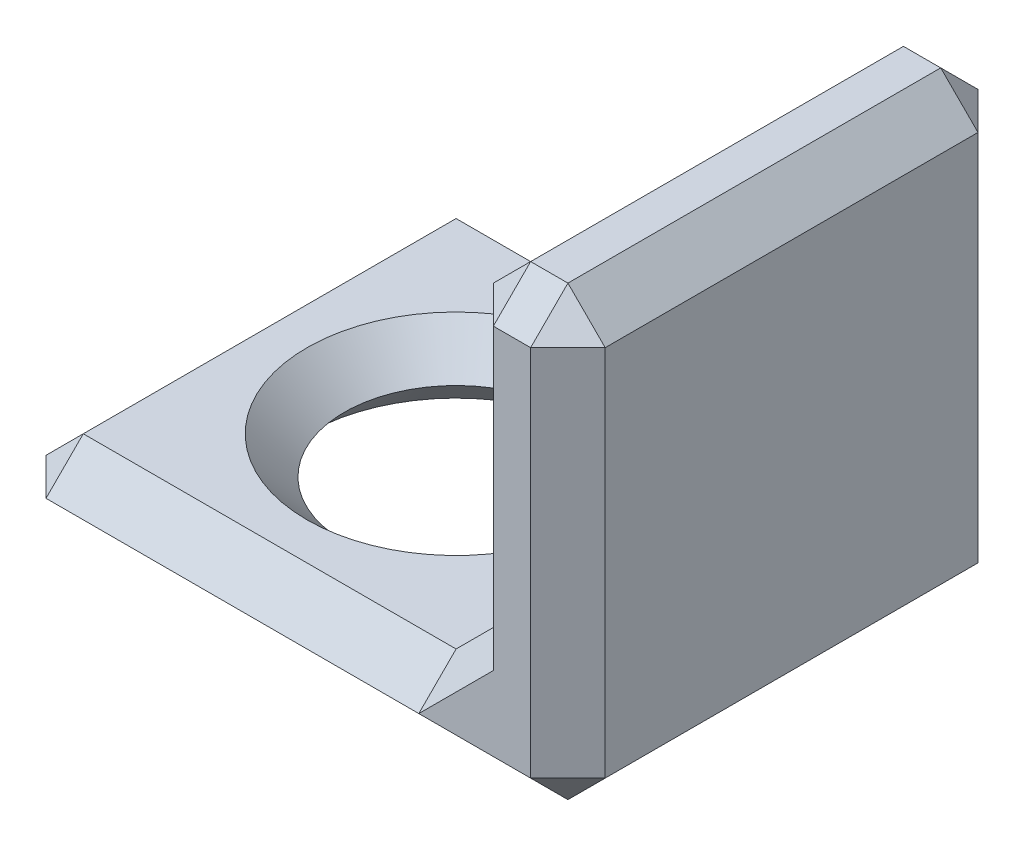
ISO-10303-21;
HEADER;
FILE_DESCRIPTION(('STEP AP214'),'2;1');
FILE_NAME('part.step','',(''),(''),'','','');
FILE_SCHEMA(('AUTOMOTIVE_DESIGN { 1 0 10303 214 1 1 1 1 }'));
ENDSEC;
DATA;
#1=APPLICATION_CONTEXT('core data for automotive mechanical design processes');
#2=APPLICATION_PROTOCOL_DEFINITION('international standard','automotive_design',2000,#1);
#3=PRODUCT_CONTEXT('',#1,'mechanical');
#4=PRODUCT('Part','Part','',(#3));
#5=PRODUCT_RELATED_PRODUCT_CATEGORY('part','',(#4));
#6=PRODUCT_DEFINITION_FORMATION('','',#4);
#7=PRODUCT_DEFINITION_CONTEXT('part definition',#1,'design');
#8=PRODUCT_DEFINITION('design','',#6,#7);
#9=PRODUCT_DEFINITION_SHAPE('','',#8);
#10=(LENGTH_UNIT() NAMED_UNIT(*) SI_UNIT(.MILLI.,.METRE.));
#11=(NAMED_UNIT(*) PLANE_ANGLE_UNIT() SI_UNIT($,.RADIAN.));
#12=(NAMED_UNIT(*) SI_UNIT($,.STERADIAN.) SOLID_ANGLE_UNIT());
#13=UNCERTAINTY_MEASURE_WITH_UNIT(LENGTH_MEASURE(1.E-05),#10,'distance_accuracy_value','');
#14=(GEOMETRIC_REPRESENTATION_CONTEXT(3) GLOBAL_UNCERTAINTY_ASSIGNED_CONTEXT((#13)) GLOBAL_UNIT_ASSIGNED_CONTEXT((#10,
#11,#12)) REPRESENTATION_CONTEXT('',''));
#15=CARTESIAN_POINT('',(0.,0.,0.));
#16=DIRECTION('',(0.,0.,1.));
#17=DIRECTION('',(1.,0.,0.));
#18=AXIS2_PLACEMENT_3D('',#15,#16,#17);
#19=CARTESIAN_POINT('',(0.,2.,12.));
#20=DIRECTION('',(0.,0.,-1.));
#21=DIRECTION('',(-1.,0.,0.));
#22=AXIS2_PLACEMENT_3D('',#19,#20,#21);
#23=PLANE('',#22);
#24=DIRECTION('',(0.707106781186546,0.707106781186549,0.));
#25=VECTOR('',#24,1.);
#26=CARTESIAN_POINT('',(13.,3.,12.));
#27=LINE('',#26,#25);
#28=CARTESIAN_POINT('',(12.,2.,12.));
#29=VERTEX_POINT('',#28);
#30=CARTESIAN_POINT('',(13.,3.,12.));
#31=VERTEX_POINT('',#30);
#32=EDGE_CURVE('E11',#29,#31,#27,.T.);
#33=ORIENTED_EDGE('',*,*,#32,.F.);
#34=DIRECTION('',(0.707106781186546,0.707106781186549,0.));
#35=VECTOR('',#34,1.);
#36=CARTESIAN_POINT('',(13.,3.,12.));
#37=LINE('',#36,#35);
#38=CARTESIAN_POINT('',(11.,0.999999999999997,12.));
#39=VERTEX_POINT('',#38);
#40=EDGE_CURVE('E203',#39,#29,#37,.T.);
#41=ORIENTED_EDGE('',*,*,#40,.F.);
#42=DIRECTION('',(1.,0.,0.));
#43=VECTOR('',#42,1.);
#44=CARTESIAN_POINT('',(0.,0.999999999999997,12.));
#45=LINE('',#44,#43);
#46=CARTESIAN_POINT('',(14.,0.999999999999997,12.));
#47=VERTEX_POINT('',#46);
#48=EDGE_CURVE('E186',#39,#47,#45,.T.);
#49=ORIENTED_EDGE('',*,*,#48,.T.);
#50=DIRECTION('',(0.,1.,0.));
#51=VECTOR('',#50,1.);
#52=CARTESIAN_POINT('',(14.,12.,12.));
#53=LINE('',#52,#51);
#54=CARTESIAN_POINT('',(14.,11.,12.));
#55=VERTEX_POINT('',#54);
#56=EDGE_CURVE('E181',#47,#55,#53,.T.);
#57=ORIENTED_EDGE('',*,*,#56,.T.);
#58=DIRECTION('',(-1.,0.,0.));
#59=VECTOR('',#58,1.);
#60=CARTESIAN_POINT('',(12.,11.,12.));
#61=LINE('',#60,#59);
#62=CARTESIAN_POINT('',(13.,11.,12.));
#63=VERTEX_POINT('',#62);
#64=EDGE_CURVE('E183',#55,#63,#61,.T.);
#65=ORIENTED_EDGE('',*,*,#64,.T.);
#66=DIRECTION('',(0.,-1.,0.));
#67=VECTOR('',#66,1.);
#68=CARTESIAN_POINT('',(13.,2.,12.));
#69=LINE('',#68,#67);
#70=EDGE_CURVE('E59',#63,#31,#69,.T.);
#71=ORIENTED_EDGE('',*,*,#70,.T.);
#72=EDGE_LOOP('',(#33,#41,#49,#57,#65,#71));
#73=FACE_BOUND('',#72,.T.);
#74=ADVANCED_FACE('F47',(#73),#23,.F.);
#75=CARTESIAN_POINT('',(0.,2.,0.));
#76=DIRECTION('',(0.,1.,0.));
#77=DIRECTION('',(0.,0.,1.));
#78=AXIS2_PLACEMENT_3D('',#75,#76,#77);
#79=PLANE('',#78);
#80=CARTESIAN_POINT('',(6.,2.,6.));
#81=DIRECTION('',(0.,1.,0.));
#82=DIRECTION('',(0.,0.,1.));
#83=AXIS2_PLACEMENT_3D('',#80,#81,#82);
#84=CIRCLE('',#83,4.00000000000001);
#85=CARTESIAN_POINT('',(6.,2.,10.));
#86=VERTEX_POINT('',#85);
#87=EDGE_CURVE('E425',#86,#86,#84,.F.);
#88=ORIENTED_EDGE('',*,*,#87,.T.);
#89=EDGE_LOOP('',(#88));
#90=FACE_BOUND('',#89,.T.);
#91=DIRECTION('',(0.,0.,-1.));
#92=VECTOR('',#91,1.);
#93=CARTESIAN_POINT('',(11.,2.,0.));
#94=LINE('',#93,#92);
#95=CARTESIAN_POINT('',(11.,2.,11.));
#96=VERTEX_POINT('',#95);
#97=CARTESIAN_POINT('',(11.,2.,0.999999999999997));
#98=VERTEX_POINT('',#97);
#99=EDGE_CURVE('E272',#96,#98,#94,.T.);
#100=ORIENTED_EDGE('',*,*,#99,.T.);
#101=DIRECTION('',(-1.,0.,0.));
#102=VECTOR('',#101,1.);
#103=CARTESIAN_POINT('',(0.,2.,0.999999999999997));
#104=LINE('',#103,#102);
#105=CARTESIAN_POINT('',(0.999999999999997,2.,0.999999999999997));
#106=VERTEX_POINT('',#105);
#107=EDGE_CURVE('E420',#98,#106,#104,.T.);
#108=ORIENTED_EDGE('',*,*,#107,.T.);
#109=DIRECTION('',(0.,0.,1.));
#110=VECTOR('',#109,1.);
#111=CARTESIAN_POINT('',(0.999999999999997,2.,12.));
#112=LINE('',#111,#110);
#113=CARTESIAN_POINT('',(0.999999999999997,2.,11.));
#114=VERTEX_POINT('',#113);
#115=EDGE_CURVE('E416',#106,#114,#112,.T.);
#116=ORIENTED_EDGE('',*,*,#115,.T.);
#117=DIRECTION('',(1.,0.,0.));
#118=VECTOR('',#117,1.);
#119=CARTESIAN_POINT('',(12.,2.,11.));
#120=LINE('',#119,#118);
#121=EDGE_CURVE('E265',#114,#96,#120,.T.);
#122=ORIENTED_EDGE('',*,*,#121,.T.);
#123=EDGE_LOOP('',(#100,#108,#116,#122));
#124=FACE_BOUND('',#123,.T.);
#125=ADVANCED_FACE('F518',(#90,#124),#79,.T.);
#126=CARTESIAN_POINT('',(0.,0.,0.));
#127=DIRECTION('',(0.,1.,0.));
#128=DIRECTION('',(0.,0.,1.));
#129=AXIS2_PLACEMENT_3D('',#126,#127,#128);
#130=PLANE('',#129);
#131=CARTESIAN_POINT('',(6.,0.,6.));
#132=DIRECTION('',(0.,1.,0.));
#133=DIRECTION('',(0.,0.,1.));
#134=AXIS2_PLACEMENT_3D('',#131,#132,#133);
#135=CIRCLE('',#134,4.);
#136=CARTESIAN_POINT('',(6.,0.,10.));
#137=VERTEX_POINT('',#136);
#138=EDGE_CURVE('E441',#137,#137,#135,.T.);
#139=ORIENTED_EDGE('',*,*,#138,.T.);
#140=EDGE_LOOP('',(#139));
#141=FACE_BOUND('',#140,.T.);
#142=DIRECTION('',(-1.,0.,0.));
#143=VECTOR('',#142,1.);
#144=CARTESIAN_POINT('',(0.,0.,11.));
#145=LINE('',#144,#143);
#146=CARTESIAN_POINT('',(14.,0.,11.));
#147=VERTEX_POINT('',#146);
#148=CARTESIAN_POINT('',(1.,0.,11.));
#149=VERTEX_POINT('',#148);
#150=EDGE_CURVE('E429',#147,#149,#145,.T.);
#151=ORIENTED_EDGE('',*,*,#150,.T.);
#152=DIRECTION('',(0.,0.,-1.));
#153=VECTOR('',#152,1.);
#154=CARTESIAN_POINT('',(1.,0.,0.));
#155=LINE('',#154,#153);
#156=CARTESIAN_POINT('',(1.,0.,1.));
#157=VERTEX_POINT('',#156);
#158=EDGE_CURVE('E437',#149,#157,#155,.T.);
#159=ORIENTED_EDGE('',*,*,#158,.T.);
#160=DIRECTION('',(1.,0.,0.));
#161=VECTOR('',#160,1.);
#162=CARTESIAN_POINT('',(0.,0.,1.));
#163=LINE('',#162,#161);
#164=CARTESIAN_POINT('',(14.,0.,1.));
#165=VERTEX_POINT('',#164);
#166=EDGE_CURVE('E434',#157,#165,#163,.T.);
#167=ORIENTED_EDGE('',*,*,#166,.T.);
#168=DIRECTION('',(0.,0.,1.));
#169=VECTOR('',#168,1.);
#170=CARTESIAN_POINT('',(14.,0.,12.));
#171=LINE('',#170,#169);
#172=EDGE_CURVE('E381',#165,#147,#171,.T.);
#173=ORIENTED_EDGE('',*,*,#172,.T.);
#174=EDGE_LOOP('',(#151,#159,#167,#173));
#175=FACE_BOUND('',#174,.T.);
#176=ADVANCED_FACE('F522',(#141,#175),#130,.F.);
#177=CARTESIAN_POINT('',(0.,2.,0.));
#178=DIRECTION('',(0.,0.,1.));
#179=DIRECTION('',(1.,0.,0.));
#180=AXIS2_PLACEMENT_3D('',#177,#178,#179);
#181=PLANE('',#180);
#182=DIRECTION('',(0.,1.,0.));
#183=VECTOR('',#182,1.);
#184=CARTESIAN_POINT('',(13.,12.,0.));
#185=LINE('',#184,#183);
#186=CARTESIAN_POINT('',(13.,3.,0.));
#187=VERTEX_POINT('',#186);
#188=CARTESIAN_POINT('',(13.,11.,0.));
#189=VERTEX_POINT('',#188);
#190=EDGE_CURVE('E480',#187,#189,#185,.T.);
#191=ORIENTED_EDGE('',*,*,#190,.T.);
#192=DIRECTION('',(1.,0.,0.));
#193=VECTOR('',#192,1.);
#194=CARTESIAN_POINT('',(15.,11.,0.));
#195=LINE('',#194,#193);
#196=CARTESIAN_POINT('',(14.,11.,0.));
#197=VERTEX_POINT('',#196);
#198=EDGE_CURVE('E483',#189,#197,#195,.T.);
#199=ORIENTED_EDGE('',*,*,#198,.T.);
#200=DIRECTION('',(0.,-1.,0.));
#201=VECTOR('',#200,1.);
#202=CARTESIAN_POINT('',(14.,0.,0.));
#203=LINE('',#202,#201);
#204=CARTESIAN_POINT('',(14.,0.999999999999997,0.));
#205=VERTEX_POINT('',#204);
#206=EDGE_CURVE('E468',#197,#205,#203,.T.);
#207=ORIENTED_EDGE('',*,*,#206,.T.);
#208=DIRECTION('',(-1.,0.,0.));
#209=VECTOR('',#208,1.);
#210=CARTESIAN_POINT('',(0.,0.999999999999997,0.));
#211=LINE('',#210,#209);
#212=CARTESIAN_POINT('',(11.,0.999999999999997,0.));
#213=VERTEX_POINT('',#212);
#214=EDGE_CURVE('E470',#205,#213,#211,.T.);
#215=ORIENTED_EDGE('',*,*,#214,.T.);
#216=DIRECTION('',(-0.707106781186546,-0.707106781186549,0.));
#217=VECTOR('',#216,1.);
#218=CARTESIAN_POINT('',(11.,0.999999999999996,0.));
#219=LINE('',#218,#217);
#220=CARTESIAN_POINT('',(12.,2.,0.));
#221=VERTEX_POINT('',#220);
#222=EDGE_CURVE('E472',#221,#213,#219,.T.);
#223=ORIENTED_EDGE('',*,*,#222,.F.);
#224=DIRECTION('',(-0.707106781186546,-0.707106781186549,0.));
#225=VECTOR('',#224,1.);
#226=CARTESIAN_POINT('',(11.,0.999999999999996,0.));
#227=LINE('',#226,#225);
#228=EDGE_CURVE('E476',#187,#221,#227,.T.);
#229=ORIENTED_EDGE('',*,*,#228,.F.);
#230=EDGE_LOOP('',(#191,#199,#207,#215,#223,#229));
#231=FACE_BOUND('',#230,.T.);
#232=ADVANCED_FACE('F527',(#231),#181,.F.);
#233=CARTESIAN_POINT('',(12.,0.,0.));
#234=DIRECTION('',(-1.,0.,0.));
#235=DIRECTION('',(0.,0.,1.));
#236=AXIS2_PLACEMENT_3D('',#233,#234,#235);
#237=PLANE('',#236);
#238=DIRECTION('',(0.,0.,-1.));
#239=VECTOR('',#238,1.);
#240=CARTESIAN_POINT('',(12.,11.,0.));
#241=LINE('',#240,#239);
#242=CARTESIAN_POINT('',(12.,11.,11.));
#243=VERTEX_POINT('',#242);
#244=CARTESIAN_POINT('',(12.,11.,1.));
#245=VERTEX_POINT('',#244);
#246=EDGE_CURVE('E447',#243,#245,#241,.T.);
#247=ORIENTED_EDGE('',*,*,#246,.T.);
#248=DIRECTION('',(0.,-1.,0.));
#249=VECTOR('',#248,1.);
#250=CARTESIAN_POINT('',(12.,2.,1.));
#251=LINE('',#250,#249);
#252=CARTESIAN_POINT('',(12.,3.,1.));
#253=VERTEX_POINT('',#252);
#254=EDGE_CURVE('E452',#245,#253,#251,.T.);
#255=ORIENTED_EDGE('',*,*,#254,.T.);
#256=DIRECTION('',(0.,0.,1.));
#257=VECTOR('',#256,1.);
#258=CARTESIAN_POINT('',(12.,3.,12.));
#259=LINE('',#258,#257);
#260=CARTESIAN_POINT('',(12.,3.,11.));
#261=VERTEX_POINT('',#260);
#262=EDGE_CURVE('E411',#253,#261,#259,.T.);
#263=ORIENTED_EDGE('',*,*,#262,.T.);
#264=DIRECTION('',(0.,1.,0.));
#265=VECTOR('',#264,1.);
#266=CARTESIAN_POINT('',(12.,12.,11.));
#267=LINE('',#266,#265);
#268=EDGE_CURVE('E401',#261,#243,#267,.T.);
#269=ORIENTED_EDGE('',*,*,#268,.T.);
#270=EDGE_LOOP('',(#247,#255,#263,#269));
#271=FACE_BOUND('',#270,.T.);
#272=ADVANCED_FACE('F506',(#271),#237,.T.);
#273=CARTESIAN_POINT('',(15.,0.,0.));
#274=DIRECTION('',(1.,0.,0.));
#275=DIRECTION('',(0.,0.,-1.));
#276=AXIS2_PLACEMENT_3D('',#273,#274,#275);
#277=PLANE('',#276);
#278=DIRECTION('',(0.,-1.,0.));
#279=VECTOR('',#278,1.);
#280=CARTESIAN_POINT('',(15.,0.,11.));
#281=LINE('',#280,#279);
#282=CARTESIAN_POINT('',(15.,11.,11.));
#283=VERTEX_POINT('',#282);
#284=CARTESIAN_POINT('',(15.,0.999999999999997,11.));
#285=VERTEX_POINT('',#284);
#286=EDGE_CURVE('E216',#283,#285,#281,.T.);
#287=ORIENTED_EDGE('',*,*,#286,.T.);
#288=DIRECTION('',(0.,0.,-1.));
#289=VECTOR('',#288,1.);
#290=CARTESIAN_POINT('',(15.,0.999999999999997,0.));
#291=LINE('',#290,#289);
#292=CARTESIAN_POINT('',(15.,0.999999999999997,0.999999999999997));
#293=VERTEX_POINT('',#292);
#294=EDGE_CURVE('E380',#285,#293,#291,.T.);
#295=ORIENTED_EDGE('',*,*,#294,.T.);
#296=DIRECTION('',(0.,1.,0.));
#297=VECTOR('',#296,1.);
#298=CARTESIAN_POINT('',(15.,12.,0.999999999999997));
#299=LINE('',#298,#297);
#300=CARTESIAN_POINT('',(15.,11.,0.999999999999997));
#301=VERTEX_POINT('',#300);
#302=EDGE_CURVE('E382',#293,#301,#299,.T.);
#303=ORIENTED_EDGE('',*,*,#302,.T.);
#304=DIRECTION('',(0.,0.,1.));
#305=VECTOR('',#304,1.);
#306=CARTESIAN_POINT('',(15.,11.,0.));
#307=LINE('',#306,#305);
#308=EDGE_CURVE('E387',#301,#283,#307,.T.);
#309=ORIENTED_EDGE('',*,*,#308,.T.);
#310=EDGE_LOOP('',(#287,#295,#303,#309));
#311=FACE_BOUND('',#310,.T.);
#312=ADVANCED_FACE('F389',(#311),#277,.T.);
#313=CARTESIAN_POINT('',(0.,12.,0.));
#314=DIRECTION('',(0.,1.,0.));
#315=DIRECTION('',(0.,0.,1.));
#316=AXIS2_PLACEMENT_3D('',#313,#314,#315);
#317=PLANE('',#316);
#318=DIRECTION('',(-1.,0.,0.));
#319=VECTOR('',#318,1.);
#320=CARTESIAN_POINT('',(12.,12.,0.999999999999997));
#321=LINE('',#320,#319);
#322=CARTESIAN_POINT('',(14.,12.,0.999999999999997));
#323=VERTEX_POINT('',#322);
#324=CARTESIAN_POINT('',(13.,12.,0.999999999999997));
#325=VERTEX_POINT('',#324);
#326=EDGE_CURVE('E461',#323,#325,#321,.T.);
#327=ORIENTED_EDGE('',*,*,#326,.T.);
#328=DIRECTION('',(0.,0.,1.));
#329=VECTOR('',#328,1.);
#330=CARTESIAN_POINT('',(13.,12.,0.));
#331=LINE('',#330,#329);
#332=CARTESIAN_POINT('',(13.,12.,11.));
#333=VERTEX_POINT('',#332);
#334=EDGE_CURVE('E464',#325,#333,#331,.T.);
#335=ORIENTED_EDGE('',*,*,#334,.T.);
#336=DIRECTION('',(1.,0.,0.));
#337=VECTOR('',#336,1.);
#338=CARTESIAN_POINT('',(15.,12.,11.));
#339=LINE('',#338,#337);
#340=CARTESIAN_POINT('',(14.,12.,11.));
#341=VERTEX_POINT('',#340);
#342=EDGE_CURVE('E455',#333,#341,#339,.T.);
#343=ORIENTED_EDGE('',*,*,#342,.T.);
#344=DIRECTION('',(0.,0.,-1.));
#345=VECTOR('',#344,1.);
#346=CARTESIAN_POINT('',(14.,12.,0.));
#347=LINE('',#346,#345);
#348=EDGE_CURVE('E458',#341,#323,#347,.T.);
#349=ORIENTED_EDGE('',*,*,#348,.T.);
#350=EDGE_LOOP('',(#327,#335,#343,#349));
#351=FACE_BOUND('',#350,.T.);
#352=ADVANCED_FACE('F489',(#351),#317,.T.);
#353=CARTESIAN_POINT('',(6.,0.,6.));
#354=DIRECTION('',(0.,-1.,0.));
#355=DIRECTION('',(0.,0.,-1.));
#356=AXIS2_PLACEMENT_3D('',#353,#354,#355);
#357=CONICAL_SURFACE('',#356,4.,0.785398163397447);
#358=ORIENTED_EDGE('',*,*,#138,.F.);
#359=EDGE_LOOP('',(#358));
#360=FACE_BOUND('',#359,.T.);
#361=CARTESIAN_POINT('',(6.,0.999999999999999,6.));
#362=DIRECTION('',(0.,1.,0.));
#363=DIRECTION('',(0.,0.,1.));
#364=AXIS2_PLACEMENT_3D('',#361,#362,#363);
#365=CIRCLE('',#364,3.);
#366=CARTESIAN_POINT('',(6.,0.999999999999999,9.));
#367=VERTEX_POINT('',#366);
#368=EDGE_CURVE('E258',#367,#367,#365,.F.);
#369=ORIENTED_EDGE('',*,*,#368,.F.);
#370=EDGE_LOOP('',(#369));
#371=FACE_BOUND('',#370,.T.);
#372=ADVANCED_FACE('F536',(#360,#371),#357,.F.);
#373=CARTESIAN_POINT('',(6.,0.999999999999998,6.));
#374=DIRECTION('',(0.,1.,0.));
#375=DIRECTION('',(0.,0.,1.));
#376=AXIS2_PLACEMENT_3D('',#373,#374,#375);
#377=CONICAL_SURFACE('',#376,3.,0.78539816339745);
#378=ORIENTED_EDGE('',*,*,#87,.F.);
#379=EDGE_LOOP('',(#378));
#380=FACE_BOUND('',#379,.T.);
#381=ORIENTED_EDGE('',*,*,#368,.T.);
#382=EDGE_LOOP('',(#381));
#383=FACE_BOUND('',#382,.T.);
#384=ADVANCED_FACE('F530',(#380,#383),#377,.F.);
#385=CARTESIAN_POINT('',(14.,12.,0.));
#386=DIRECTION('',(-0.707106781186549,-0.707106781186546,0.));
#387=DIRECTION('',(0.,0.,-1.));
#388=AXIS2_PLACEMENT_3D('',#385,#386,#387);
#389=PLANE('',#388);
#390=DIRECTION('',(-0.707106781186546,0.707106781186549,0.));
#391=VECTOR('',#390,1.);
#392=CARTESIAN_POINT('',(14.5,11.5,0.999999999999998));
#393=LINE('',#392,#391);
#394=EDGE_CURVE('E52',#323,#301,#393,.F.);
#395=ORIENTED_EDGE('',*,*,#394,.F.);
#396=ORIENTED_EDGE('',*,*,#348,.F.);
#397=DIRECTION('',(0.707106781186546,-0.707106781186549,0.));
#398=VECTOR('',#397,1.);
#399=CARTESIAN_POINT('',(15.,11.,11.));
#400=LINE('',#399,#398);
#401=EDGE_CURVE('E211',#283,#341,#400,.F.);
#402=ORIENTED_EDGE('',*,*,#401,.F.);
#403=ORIENTED_EDGE('',*,*,#308,.F.);
#404=EDGE_LOOP('',(#395,#396,#402,#403));
#405=FACE_BOUND('',#404,.T.);
#406=ADVANCED_FACE('F50',(#405),#389,.F.);
#407=CARTESIAN_POINT('',(14.,11.,0.));
#408=DIRECTION('',(0.577350269189626,0.577350269189624,-0.577350269189628));
#409=DIRECTION('',(-0.707106781186549,0.,-0.707106781186546));
#410=AXIS2_PLACEMENT_3D('',#407,#408,#409);
#411=PLANE('',#410);
#412=DIRECTION('',(-0.707106781186549,0.,-0.707106781186546));
#413=VECTOR('',#412,1.);
#414=CARTESIAN_POINT('',(14.,11.,0.));
#415=LINE('',#414,#413);
#416=EDGE_CURVE('E242',#197,#301,#415,.F.);
#417=ORIENTED_EDGE('',*,*,#416,.F.);
#418=DIRECTION('',(0.,0.707106781186549,0.707106781186546));
#419=VECTOR('',#418,1.);
#420=CARTESIAN_POINT('',(14.,11.,0.));
#421=LINE('',#420,#419);
#422=EDGE_CURVE('E213',#323,#197,#421,.F.);
#423=ORIENTED_EDGE('',*,*,#422,.F.);
#424=ORIENTED_EDGE('',*,*,#394,.T.);
#425=EDGE_LOOP('',(#417,#423,#424));
#426=FACE_BOUND('',#425,.T.);
#427=ADVANCED_FACE('F685',(#426),#411,.T.);
#428=CARTESIAN_POINT('',(0.,12.,0.999999999999997));
#429=DIRECTION('',(0.,0.707106781186546,-0.707106781186549));
#430=DIRECTION('',(1.,0.,0.));
#431=AXIS2_PLACEMENT_3D('',#428,#429,#430);
#432=PLANE('',#431);
#433=ORIENTED_EDGE('',*,*,#422,.T.);
#434=ORIENTED_EDGE('',*,*,#198,.F.);
#435=DIRECTION('',(0.,-0.707106781186549,-0.707106781186546));
#436=VECTOR('',#435,1.);
#437=CARTESIAN_POINT('',(13.,11.5,0.499999999999999));
#438=LINE('',#437,#436);
#439=EDGE_CURVE('E238',#325,#189,#438,.T.);
#440=ORIENTED_EDGE('',*,*,#439,.F.);
#441=ORIENTED_EDGE('',*,*,#326,.F.);
#442=EDGE_LOOP('',(#433,#434,#440,#441));
#443=FACE_BOUND('',#442,.T.);
#444=ADVANCED_FACE('F498',(#443),#432,.T.);
#445=CARTESIAN_POINT('',(13.,12.,0.));
#446=DIRECTION('',(0.707106781186549,-0.707106781186546,0.));
#447=DIRECTION('',(0.,0.,1.));
#448=AXIS2_PLACEMENT_3D('',#445,#446,#447);
#449=PLANE('',#448);
#450=DIRECTION('',(0.707106781186546,0.707106781186549,0.));
#451=VECTOR('',#450,1.);
#452=CARTESIAN_POINT('',(13.,12.,11.));
#453=LINE('',#452,#451);
#454=EDGE_CURVE('E223',#333,#243,#453,.F.);
#455=ORIENTED_EDGE('',*,*,#454,.F.);
#456=ORIENTED_EDGE('',*,*,#334,.F.);
#457=DIRECTION('',(-0.707106781186546,-0.707106781186549,0.));
#458=VECTOR('',#457,1.);
#459=CARTESIAN_POINT('',(12.,11.,1.));
#460=LINE('',#459,#458);
#461=EDGE_CURVE('E234',#245,#325,#460,.F.);
#462=ORIENTED_EDGE('',*,*,#461,.F.);
#463=ORIENTED_EDGE('',*,*,#246,.F.);
#464=EDGE_LOOP('',(#455,#456,#462,#463));
#465=FACE_BOUND('',#464,.T.);
#466=ADVANCED_FACE('F495',(#465),#449,.F.);
#467=CARTESIAN_POINT('',(0.,12.,11.));
#468=DIRECTION('',(0.,0.707106781186549,0.707106781186546));
#469=DIRECTION('',(-1.,0.,0.));
#470=AXIS2_PLACEMENT_3D('',#467,#468,#469);
#471=PLANE('',#470);
#472=DIRECTION('',(0.,-0.707106781186546,0.707106781186549));
#473=VECTOR('',#472,1.);
#474=CARTESIAN_POINT('',(14.,11.5,11.5));
#475=LINE('',#474,#473);
#476=EDGE_CURVE('E198',#341,#55,#475,.T.);
#477=ORIENTED_EDGE('',*,*,#476,.F.);
#478=ORIENTED_EDGE('',*,*,#342,.F.);
#479=DIRECTION('',(0.,0.707106781186546,-0.707106781186549));
#480=VECTOR('',#479,1.);
#481=CARTESIAN_POINT('',(13.,12.,11.));
#482=LINE('',#481,#480);
#483=EDGE_CURVE('E200',#63,#333,#482,.T.);
#484=ORIENTED_EDGE('',*,*,#483,.F.);
#485=ORIENTED_EDGE('',*,*,#64,.F.);
#486=EDGE_LOOP('',(#477,#478,#484,#485));
#487=FACE_BOUND('',#486,.T.);
#488=ADVANCED_FACE('F196',(#487),#471,.T.);
#489=CARTESIAN_POINT('',(15.,11.,11.));
#490=DIRECTION('',(0.577350269189628,0.577350269189626,0.577350269189624));
#491=DIRECTION('',(-0.707106781186546,0.707106781186549,0.));
#492=AXIS2_PLACEMENT_3D('',#489,#490,#491);
#493=PLANE('',#492);
#494=ORIENTED_EDGE('',*,*,#401,.T.);
#495=ORIENTED_EDGE('',*,*,#476,.T.);
#496=DIRECTION('',(0.707106781186546,0.,-0.707106781186549));
#497=VECTOR('',#496,1.);
#498=CARTESIAN_POINT('',(15.,11.,11.));
#499=LINE('',#498,#497);
#500=EDGE_CURVE('E208',#283,#55,#499,.F.);
#501=ORIENTED_EDGE('',*,*,#500,.F.);
#502=EDGE_LOOP('',(#494,#495,#501));
#503=FACE_BOUND('',#502,.T.);
#504=ADVANCED_FACE('F207',(#503),#493,.T.);
#505=CARTESIAN_POINT('',(15.,0.,0.999999999999997));
#506=DIRECTION('',(0.707106781186546,0.,-0.707106781186549));
#507=DIRECTION('',(0.,-1.,0.));
#508=AXIS2_PLACEMENT_3D('',#505,#506,#507);
#509=PLANE('',#508);
#510=ORIENTED_EDGE('',*,*,#416,.T.);
#511=ORIENTED_EDGE('',*,*,#302,.F.);
#512=DIRECTION('',(0.707106781186549,0.,0.707106781186546));
#513=VECTOR('',#512,1.);
#514=CARTESIAN_POINT('',(14.5,0.999999999999997,0.499999999999999));
#515=LINE('',#514,#513);
#516=EDGE_CURVE('E227',#205,#293,#515,.T.);
#517=ORIENTED_EDGE('',*,*,#516,.F.);
#518=ORIENTED_EDGE('',*,*,#206,.F.);
#519=EDGE_LOOP('',(#510,#511,#517,#518));
#520=FACE_BOUND('',#519,.T.);
#521=ADVANCED_FACE('F383',(#520),#509,.T.);
#522=CARTESIAN_POINT('',(12.,11.,1.));
#523=DIRECTION('',(-0.577350269189628,0.577350269189624,-0.577350269189626));
#524=DIRECTION('',(-0.707106781186546,0.,0.707106781186549));
#525=AXIS2_PLACEMENT_3D('',#522,#523,#524);
#526=PLANE('',#525);
#527=ORIENTED_EDGE('',*,*,#461,.T.);
#528=ORIENTED_EDGE('',*,*,#439,.T.);
#529=DIRECTION('',(-0.707106781186546,0.,0.707106781186549));
#530=VECTOR('',#529,1.);
#531=CARTESIAN_POINT('',(12.,11.,1.));
#532=LINE('',#531,#530);
#533=EDGE_CURVE('E361',#245,#189,#532,.F.);
#534=ORIENTED_EDGE('',*,*,#533,.F.);
#535=EDGE_LOOP('',(#527,#528,#534));
#536=FACE_BOUND('',#535,.T.);
#537=ADVANCED_FACE('F500',(#536),#526,.T.);
#538=CARTESIAN_POINT('',(13.,12.,11.));
#539=DIRECTION('',(-0.577350269189628,0.577350269189626,0.577350269189624));
#540=DIRECTION('',(-0.707106781186546,-0.707106781186549,0.));
#541=AXIS2_PLACEMENT_3D('',#538,#539,#540);
#542=PLANE('',#541);
#543=ORIENTED_EDGE('',*,*,#483,.T.);
#544=ORIENTED_EDGE('',*,*,#454,.T.);
#545=DIRECTION('',(0.707106781186546,0.,0.707106781186549));
#546=VECTOR('',#545,1.);
#547=CARTESIAN_POINT('',(12.5,11.,11.5));
#548=LINE('',#547,#546);
#549=EDGE_CURVE('E357',#63,#243,#548,.F.);
#550=ORIENTED_EDGE('',*,*,#549,.F.);
#551=EDGE_LOOP('',(#543,#544,#550));
#552=FACE_BOUND('',#551,.T.);
#553=ADVANCED_FACE('F508',(#552),#542,.T.);
#554=CARTESIAN_POINT('',(14.,2.,12.));
#555=DIRECTION('',(0.707106781186549,0.,0.707106781186546));
#556=DIRECTION('',(0.,-1.,0.));
#557=AXIS2_PLACEMENT_3D('',#554,#555,#556);
#558=PLANE('',#557);
#559=ORIENTED_EDGE('',*,*,#500,.T.);
#560=ORIENTED_EDGE('',*,*,#56,.F.);
#561=DIRECTION('',(-0.707106781186546,0.,0.707106781186549));
#562=VECTOR('',#561,1.);
#563=CARTESIAN_POINT('',(14.5,0.999999999999997,11.5));
#564=LINE('',#563,#562);
#565=EDGE_CURVE('E354',#285,#47,#564,.T.);
#566=ORIENTED_EDGE('',*,*,#565,.F.);
#567=ORIENTED_EDGE('',*,*,#286,.F.);
#568=EDGE_LOOP('',(#559,#560,#566,#567));
#569=FACE_BOUND('',#568,.T.);
#570=ADVANCED_FACE('F215',(#569),#558,.T.);
#571=CARTESIAN_POINT('',(15.,0.999999999999997,0.));
#572=DIRECTION('',(0.707106781186546,-0.707106781186549,0.));
#573=DIRECTION('',(0.,0.,1.));
#574=AXIS2_PLACEMENT_3D('',#571,#572,#573);
#575=PLANE('',#574);
#576=DIRECTION('',(-0.707106781186549,-0.707106781186546,0.));
#577=VECTOR('',#576,1.);
#578=CARTESIAN_POINT('',(14.,0.,1.));
#579=LINE('',#578,#577);
#580=EDGE_CURVE('E218',#293,#165,#579,.T.);
#581=ORIENTED_EDGE('',*,*,#580,.F.);
#582=ORIENTED_EDGE('',*,*,#294,.F.);
#583=DIRECTION('',(0.707106781186549,0.707106781186546,0.));
#584=VECTOR('',#583,1.);
#585=CARTESIAN_POINT('',(14.,0.,11.));
#586=LINE('',#585,#584);
#587=EDGE_CURVE('E350',#147,#285,#586,.T.);
#588=ORIENTED_EDGE('',*,*,#587,.F.);
#589=ORIENTED_EDGE('',*,*,#172,.F.);
#590=EDGE_LOOP('',(#581,#582,#588,#589));
#591=FACE_BOUND('',#590,.T.);
#592=ADVANCED_FACE('F377',(#591),#575,.T.);
#593=CARTESIAN_POINT('',(14.,0.,1.));
#594=DIRECTION('',(0.577350269189624,-0.577350269189628,-0.577350269189626));
#595=DIRECTION('',(0.,0.707106781186546,-0.707106781186549));
#596=AXIS2_PLACEMENT_3D('',#593,#594,#595);
#597=PLANE('',#596);
#598=ORIENTED_EDGE('',*,*,#516,.T.);
#599=ORIENTED_EDGE('',*,*,#580,.T.);
#600=DIRECTION('',(0.,-0.707106781186546,0.707106781186549));
#601=VECTOR('',#600,1.);
#602=CARTESIAN_POINT('',(14.,0.,1.));
#603=LINE('',#602,#601);
#604=EDGE_CURVE('E346',#205,#165,#603,.T.);
#605=ORIENTED_EDGE('',*,*,#604,.F.);
#606=EDGE_LOOP('',(#598,#599,#605));
#607=FACE_BOUND('',#606,.T.);
#608=ADVANCED_FACE('F370',(#607),#597,.T.);
#609=CARTESIAN_POINT('',(13.,2.,0.));
#610=DIRECTION('',(-0.707106781186549,0.,-0.707106781186546));
#611=DIRECTION('',(0.,-1.,0.));
#612=AXIS2_PLACEMENT_3D('',#609,#610,#611);
#613=PLANE('',#612);
#614=ORIENTED_EDGE('',*,*,#533,.T.);
#615=ORIENTED_EDGE('',*,*,#190,.F.);
#616=DIRECTION('',(0.707106781186546,0.,-0.707106781186549));
#617=VECTOR('',#616,1.);
#618=CARTESIAN_POINT('',(12.,3.,1.));
#619=LINE('',#618,#617);
#620=EDGE_CURVE('E342',#253,#187,#619,.T.);
#621=ORIENTED_EDGE('',*,*,#620,.F.);
#622=ORIENTED_EDGE('',*,*,#254,.F.);
#623=EDGE_LOOP('',(#614,#615,#621,#622));
#624=FACE_BOUND('',#623,.T.);
#625=ADVANCED_FACE('F504',(#624),#613,.T.);
#626=CARTESIAN_POINT('',(11.,2.,0.));
#627=DIRECTION('',(-0.707106781186549,0.707106781186546,0.));
#628=DIRECTION('',(0.,0.,1.));
#629=AXIS2_PLACEMENT_3D('',#626,#627,#628);
#630=PLANE('',#629);
#631=DIRECTION('',(0.707106781186546,0.707106781186549,0.));
#632=VECTOR('',#631,1.);
#633=CARTESIAN_POINT('',(12.,3.,11.));
#634=LINE('',#633,#632);
#635=EDGE_CURVE('E334',#261,#96,#634,.F.);
#636=ORIENTED_EDGE('',*,*,#635,.F.);
#637=ORIENTED_EDGE('',*,*,#262,.F.);
#638=DIRECTION('',(-0.707106781186546,-0.707106781186549,0.));
#639=VECTOR('',#638,1.);
#640=CARTESIAN_POINT('',(11.,2.,0.999999999999997));
#641=LINE('',#640,#639);
#642=EDGE_CURVE('E338',#98,#253,#641,.F.);
#643=ORIENTED_EDGE('',*,*,#642,.F.);
#644=ORIENTED_EDGE('',*,*,#99,.F.);
#645=EDGE_LOOP('',(#636,#637,#643,#644));
#646=FACE_BOUND('',#645,.T.);
#647=ADVANCED_FACE('F409',(#646),#630,.T.);
#648=CARTESIAN_POINT('',(12.,0.,11.));
#649=DIRECTION('',(-0.707106781186549,0.,0.707106781186546));
#650=DIRECTION('',(0.,-1.,0.));
#651=AXIS2_PLACEMENT_3D('',#648,#649,#650);
#652=PLANE('',#651);
#653=ORIENTED_EDGE('',*,*,#549,.T.);
#654=ORIENTED_EDGE('',*,*,#268,.F.);
#655=DIRECTION('',(-0.707106781186546,0.,-0.707106781186549));
#656=VECTOR('',#655,1.);
#657=CARTESIAN_POINT('',(13.,3.,12.));
#658=LINE('',#657,#656);
#659=EDGE_CURVE('E332',#31,#261,#658,.T.);
#660=ORIENTED_EDGE('',*,*,#659,.F.);
#661=ORIENTED_EDGE('',*,*,#70,.F.);
#662=EDGE_LOOP('',(#653,#654,#660,#661));
#663=FACE_BOUND('',#662,.T.);
#664=ADVANCED_FACE('F399',(#663),#652,.T.);
#665=CARTESIAN_POINT('',(14.,0.,11.));
#666=DIRECTION('',(0.577350269189626,-0.577350269189628,0.577350269189624));
#667=DIRECTION('',(0.707106781186549,0.707106781186546,0.));
#668=AXIS2_PLACEMENT_3D('',#665,#666,#667);
#669=PLANE('',#668);
#670=ORIENTED_EDGE('',*,*,#587,.T.);
#671=ORIENTED_EDGE('',*,*,#565,.T.);
#672=DIRECTION('',(0.,0.707106781186546,0.707106781186549));
#673=VECTOR('',#672,1.);
#674=CARTESIAN_POINT('',(14.,0.,11.));
#675=LINE('',#674,#673);
#676=EDGE_CURVE('E329',#147,#47,#675,.T.);
#677=ORIENTED_EDGE('',*,*,#676,.F.);
#678=EDGE_LOOP('',(#670,#671,#677));
#679=FACE_BOUND('',#678,.T.);
#680=ADVANCED_FACE('F624',(#679),#669,.T.);
#681=CARTESIAN_POINT('',(0.,0.999999999999997,0.));
#682=DIRECTION('',(0.,0.707106781186549,0.707106781186546));
#683=DIRECTION('',(-1.,0.,0.));
#684=AXIS2_PLACEMENT_3D('',#681,#682,#683);
#685=PLANE('',#684);
#686=ORIENTED_EDGE('',*,*,#604,.T.);
#687=ORIENTED_EDGE('',*,*,#166,.F.);
#688=DIRECTION('',(0.,0.707106781186546,-0.707106781186549));
#689=VECTOR('',#688,1.);
#690=CARTESIAN_POINT('',(1.,0.,1.));
#691=LINE('',#690,#689);
#692=CARTESIAN_POINT('',(1.,0.999999999999999,0.));
#693=VERTEX_POINT('',#692);
#694=EDGE_CURVE('E91',#693,#157,#691,.F.);
#695=ORIENTED_EDGE('',*,*,#694,.F.);
#696=DIRECTION('',(-1.,0.,0.));
#697=VECTOR('',#696,1.);
#698=CARTESIAN_POINT('',(0.,0.999999999999997,0.));
#699=LINE('',#698,#697);
#700=EDGE_CURVE('E317',#213,#693,#699,.T.);
#701=ORIENTED_EDGE('',*,*,#700,.F.);
#702=ORIENTED_EDGE('',*,*,#214,.F.);
#703=EDGE_LOOP('',(#686,#687,#695,#701,#702));
#704=FACE_BOUND('',#703,.T.);
#705=ADVANCED_FACE('F617',(#704),#685,.F.);
#706=CARTESIAN_POINT('',(11.,2.,0.999999999999997));
#707=DIRECTION('',(-0.577350269189625,0.577350269189625,-0.577350269189627));
#708=DIRECTION('',(-0.707106781186549,0.,0.707106781186546));
#709=AXIS2_PLACEMENT_3D('',#706,#707,#708);
#710=PLANE('',#709);
#711=ORIENTED_EDGE('',*,*,#228,.T.);
#712=ORIENTED_EDGE('',*,*,#222,.T.);
#713=DIRECTION('',(0.,0.707106781186549,0.707106781186546));
#714=VECTOR('',#713,1.);
#715=CARTESIAN_POINT('',(11.,0.999999999999999,0.));
#716=LINE('',#715,#714);
#717=EDGE_CURVE('E313',#98,#213,#716,.F.);
#718=ORIENTED_EDGE('',*,*,#717,.F.);
#719=ORIENTED_EDGE('',*,*,#642,.T.);
#720=ORIENTED_EDGE('',*,*,#620,.T.);
#721=EDGE_LOOP('',(#711,#712,#718,#719,#720));
#722=FACE_BOUND('',#721,.T.);
#723=ADVANCED_FACE('F611',(#722),#710,.T.);
#724=CARTESIAN_POINT('',(12.,3.,11.));
#725=DIRECTION('',(-0.577350269189627,0.577350269189625,0.577350269189625));
#726=DIRECTION('',(0.707106781186546,0.,0.707106781186549));
#727=AXIS2_PLACEMENT_3D('',#724,#725,#726);
#728=PLANE('',#727);
#729=ORIENTED_EDGE('',*,*,#659,.T.);
#730=ORIENTED_EDGE('',*,*,#635,.T.);
#731=DIRECTION('',(0.,-0.707106781186546,0.707106781186549));
#732=VECTOR('',#731,1.);
#733=CARTESIAN_POINT('',(11.,2.,11.));
#734=LINE('',#733,#732);
#735=EDGE_CURVE('E309',#39,#96,#734,.F.);
#736=ORIENTED_EDGE('',*,*,#735,.F.);
#737=ORIENTED_EDGE('',*,*,#40,.T.);
#738=ORIENTED_EDGE('',*,*,#32,.T.);
#739=EDGE_LOOP('',(#729,#730,#736,#737,#738));
#740=FACE_BOUND('',#739,.T.);
#741=ADVANCED_FACE('F404',(#740),#728,.T.);
#742=CARTESIAN_POINT('',(0.,0.999999999999997,12.));
#743=DIRECTION('',(0.,0.707106781186549,-0.707106781186546));
#744=DIRECTION('',(1.,0.,0.));
#745=AXIS2_PLACEMENT_3D('',#742,#743,#744);
#746=PLANE('',#745);
#747=DIRECTION('',(0.,-0.707106781186546,-0.707106781186549));
#748=VECTOR('',#747,1.);
#749=CARTESIAN_POINT('',(1.,0.499999999999999,11.5));
#750=LINE('',#749,#748);
#751=CARTESIAN_POINT('',(0.999999999999997,1.,12.));
#752=VERTEX_POINT('',#751);
#753=EDGE_CURVE('E83',#149,#752,#750,.F.);
#754=ORIENTED_EDGE('',*,*,#753,.F.);
#755=ORIENTED_EDGE('',*,*,#150,.F.);
#756=ORIENTED_EDGE('',*,*,#676,.T.);
#757=ORIENTED_EDGE('',*,*,#48,.F.);
#758=DIRECTION('',(1.,0.,0.));
#759=VECTOR('',#758,1.);
#760=CARTESIAN_POINT('',(0.,0.999999999999997,12.));
#761=LINE('',#760,#759);
#762=EDGE_CURVE('E305',#752,#39,#761,.T.);
#763=ORIENTED_EDGE('',*,*,#762,.F.);
#764=EDGE_LOOP('',(#754,#755,#756,#757,#763));
#765=FACE_BOUND('',#764,.T.);
#766=ADVANCED_FACE('F599',(#765),#746,.F.);
#767=CARTESIAN_POINT('',(0.,0.999999999999997,11.));
#768=DIRECTION('',(-0.577350269189626,-0.577350269189628,0.577350269189624));
#769=DIRECTION('',(0.707106781186549,-0.707106781186546,0.));
#770=AXIS2_PLACEMENT_3D('',#767,#768,#769);
#771=PLANE('',#770);
#772=DIRECTION('',(-0.707106781186549,0.707106781186546,0.));
#773=VECTOR('',#772,1.);
#774=CARTESIAN_POINT('',(0.,0.999999999999997,11.));
#775=LINE('',#774,#773);
#776=CARTESIAN_POINT('',(0.,0.999999999999999,11.));
#777=VERTEX_POINT('',#776);
#778=EDGE_CURVE('E297',#149,#777,#775,.T.);
#779=ORIENTED_EDGE('',*,*,#778,.F.);
#780=ORIENTED_EDGE('',*,*,#753,.T.);
#781=DIRECTION('',(0.707106781186546,0.,0.707106781186549));
#782=VECTOR('',#781,1.);
#783=CARTESIAN_POINT('',(0.,0.999999999999997,11.));
#784=LINE('',#783,#782);
#785=EDGE_CURVE('E301',#777,#752,#784,.T.);
#786=ORIENTED_EDGE('',*,*,#785,.F.);
#787=EDGE_LOOP('',(#779,#780,#786));
#788=FACE_BOUND('',#787,.T.);
#789=ADVANCED_FACE('F592',(#788),#771,.T.);
#790=CARTESIAN_POINT('',(1.,0.,1.));
#791=DIRECTION('',(-0.577350269189624,-0.577350269189628,-0.577350269189626));
#792=DIRECTION('',(0.,0.707106781186546,-0.707106781186549));
#793=AXIS2_PLACEMENT_3D('',#790,#791,#792);
#794=PLANE('',#793);
#795=DIRECTION('',(-0.707106781186549,0.,0.707106781186546));
#796=VECTOR('',#795,1.);
#797=CARTESIAN_POINT('',(0.500000000000001,0.999999999999997,0.499999999999999));
#798=LINE('',#797,#796);
#799=CARTESIAN_POINT('',(0.,0.999999999999999,0.999999999999997));
#800=VERTEX_POINT('',#799);
#801=EDGE_CURVE('E321',#693,#800,#798,.T.);
#802=ORIENTED_EDGE('',*,*,#801,.F.);
#803=ORIENTED_EDGE('',*,*,#694,.T.);
#804=DIRECTION('',(0.707106781186549,-0.707106781186546,0.));
#805=VECTOR('',#804,1.);
#806=CARTESIAN_POINT('',(1.,0.,1.));
#807=LINE('',#806,#805);
#808=EDGE_CURVE('E294',#800,#157,#807,.T.);
#809=ORIENTED_EDGE('',*,*,#808,.F.);
#810=EDGE_LOOP('',(#802,#803,#809));
#811=FACE_BOUND('',#810,.T.);
#812=ADVANCED_FACE('F585',(#811),#794,.T.);
#813=CARTESIAN_POINT('',(0.,2.,0.999999999999997));
#814=DIRECTION('',(0.,0.707106781186546,-0.707106781186549));
#815=DIRECTION('',(1.,0.,0.));
#816=AXIS2_PLACEMENT_3D('',#813,#814,#815);
#817=PLANE('',#816);
#818=ORIENTED_EDGE('',*,*,#717,.T.);
#819=ORIENTED_EDGE('',*,*,#700,.T.);
#820=DIRECTION('',(0.,-0.707106781186549,-0.707106781186546));
#821=VECTOR('',#820,1.);
#822=CARTESIAN_POINT('',(0.999999999999999,1.5,0.499999999999999));
#823=LINE('',#822,#821);
#824=EDGE_CURVE('E291',#106,#693,#823,.T.);
#825=ORIENTED_EDGE('',*,*,#824,.F.);
#826=ORIENTED_EDGE('',*,*,#107,.F.);
#827=EDGE_LOOP('',(#818,#819,#825,#826));
#828=FACE_BOUND('',#827,.T.);
#829=ADVANCED_FACE('F578',(#828),#817,.T.);
#830=CARTESIAN_POINT('',(0.,2.,11.));
#831=DIRECTION('',(0.,0.707106781186549,0.707106781186546));
#832=DIRECTION('',(-1.,0.,0.));
#833=AXIS2_PLACEMENT_3D('',#830,#831,#832);
#834=PLANE('',#833);
#835=ORIENTED_EDGE('',*,*,#735,.T.);
#836=ORIENTED_EDGE('',*,*,#121,.F.);
#837=DIRECTION('',(0.,0.707106781186546,-0.707106781186549));
#838=VECTOR('',#837,1.);
#839=CARTESIAN_POINT('',(0.999999999999997,2.,11.));
#840=LINE('',#839,#838);
#841=EDGE_CURVE('E287',#752,#114,#840,.T.);
#842=ORIENTED_EDGE('',*,*,#841,.F.);
#843=ORIENTED_EDGE('',*,*,#762,.T.);
#844=EDGE_LOOP('',(#835,#836,#842,#843));
#845=FACE_BOUND('',#844,.T.);
#846=ADVANCED_FACE('F571',(#845),#834,.T.);
#847=CARTESIAN_POINT('',(0.,0.999999999999997,0.));
#848=DIRECTION('',(0.707106781186546,0.707106781186549,0.));
#849=DIRECTION('',(0.,0.,1.));
#850=AXIS2_PLACEMENT_3D('',#847,#848,#849);
#851=PLANE('',#850);
#852=ORIENTED_EDGE('',*,*,#158,.F.);
#853=ORIENTED_EDGE('',*,*,#778,.T.);
#854=DIRECTION('',(0.,0.,1.));
#855=VECTOR('',#854,1.);
#856=CARTESIAN_POINT('',(0.,0.999999999999997,0.));
#857=LINE('',#856,#855);
#858=EDGE_CURVE('E283',#800,#777,#857,.T.);
#859=ORIENTED_EDGE('',*,*,#858,.F.);
#860=ORIENTED_EDGE('',*,*,#808,.T.);
#861=EDGE_LOOP('',(#852,#853,#859,#860));
#862=FACE_BOUND('',#861,.T.);
#863=ADVANCED_FACE('F564',(#862),#851,.F.);
#864=CARTESIAN_POINT('',(0.,0.999999999999999,0.999999999999997));
#865=DIRECTION('',(-0.577350269189626,0.577350269189624,-0.577350269189628));
#866=DIRECTION('',(-0.707106781186549,0.,0.707106781186546));
#867=AXIS2_PLACEMENT_3D('',#864,#865,#866);
#868=PLANE('',#867);
#869=ORIENTED_EDGE('',*,*,#824,.T.);
#870=ORIENTED_EDGE('',*,*,#801,.T.);
#871=DIRECTION('',(0.707106781186546,0.707106781186549,0.));
#872=VECTOR('',#871,1.);
#873=CARTESIAN_POINT('',(0.,0.999999999999999,0.999999999999997));
#874=LINE('',#873,#872);
#875=EDGE_CURVE('E279',#106,#800,#874,.F.);
#876=ORIENTED_EDGE('',*,*,#875,.F.);
#877=EDGE_LOOP('',(#869,#870,#876));
#878=FACE_BOUND('',#877,.T.);
#879=ADVANCED_FACE('F557',(#878),#868,.T.);
#880=CARTESIAN_POINT('',(0.999999999999997,2.,11.));
#881=DIRECTION('',(-0.577350269189628,0.577350269189626,0.577350269189624));
#882=DIRECTION('',(-0.707106781186546,-0.707106781186549,0.));
#883=AXIS2_PLACEMENT_3D('',#880,#881,#882);
#884=PLANE('',#883);
#885=ORIENTED_EDGE('',*,*,#785,.T.);
#886=ORIENTED_EDGE('',*,*,#841,.T.);
#887=DIRECTION('',(-0.707106781186546,-0.707106781186549,0.));
#888=VECTOR('',#887,1.);
#889=CARTESIAN_POINT('',(0.999999999999997,2.,11.));
#890=LINE('',#889,#888);
#891=EDGE_CURVE('E276',#777,#114,#890,.F.);
#892=ORIENTED_EDGE('',*,*,#891,.F.);
#893=EDGE_LOOP('',(#885,#886,#892));
#894=FACE_BOUND('',#893,.T.);
#895=ADVANCED_FACE('F550',(#894),#884,.T.);
#896=CARTESIAN_POINT('',(0.999999999999997,2.,0.));
#897=DIRECTION('',(-0.707106781186549,0.707106781186546,0.));
#898=DIRECTION('',(0.,0.,-1.));
#899=AXIS2_PLACEMENT_3D('',#896,#897,#898);
#900=PLANE('',#899);
#901=ORIENTED_EDGE('',*,*,#875,.T.);
#902=ORIENTED_EDGE('',*,*,#858,.T.);
#903=ORIENTED_EDGE('',*,*,#891,.T.);
#904=ORIENTED_EDGE('',*,*,#115,.F.);
#905=EDGE_LOOP('',(#901,#902,#903,#904));
#906=FACE_BOUND('',#905,.T.);
#907=ADVANCED_FACE('F544',(#906),#900,.T.);
#908=CLOSED_SHELL('',(#74,#125,#176,#232,#272,#312,#352,#372,#384,#406,#427,#444,#466,#488,#504,
#521,#537,#553,#570,#592,#608,#625,#647,#664,#680,#705,#723,#741,#766,#789,#812,#829,#846,#863,
#879,#895,#907));
#909=MANIFOLD_SOLID_BREP('B2',#908);
#910=ADVANCED_BREP_SHAPE_REPRESENTATION('',(#18,#909),#14);
#911=SHAPE_DEFINITION_REPRESENTATION(#9,#910);
ENDSEC;
END-ISO-10303-21;
